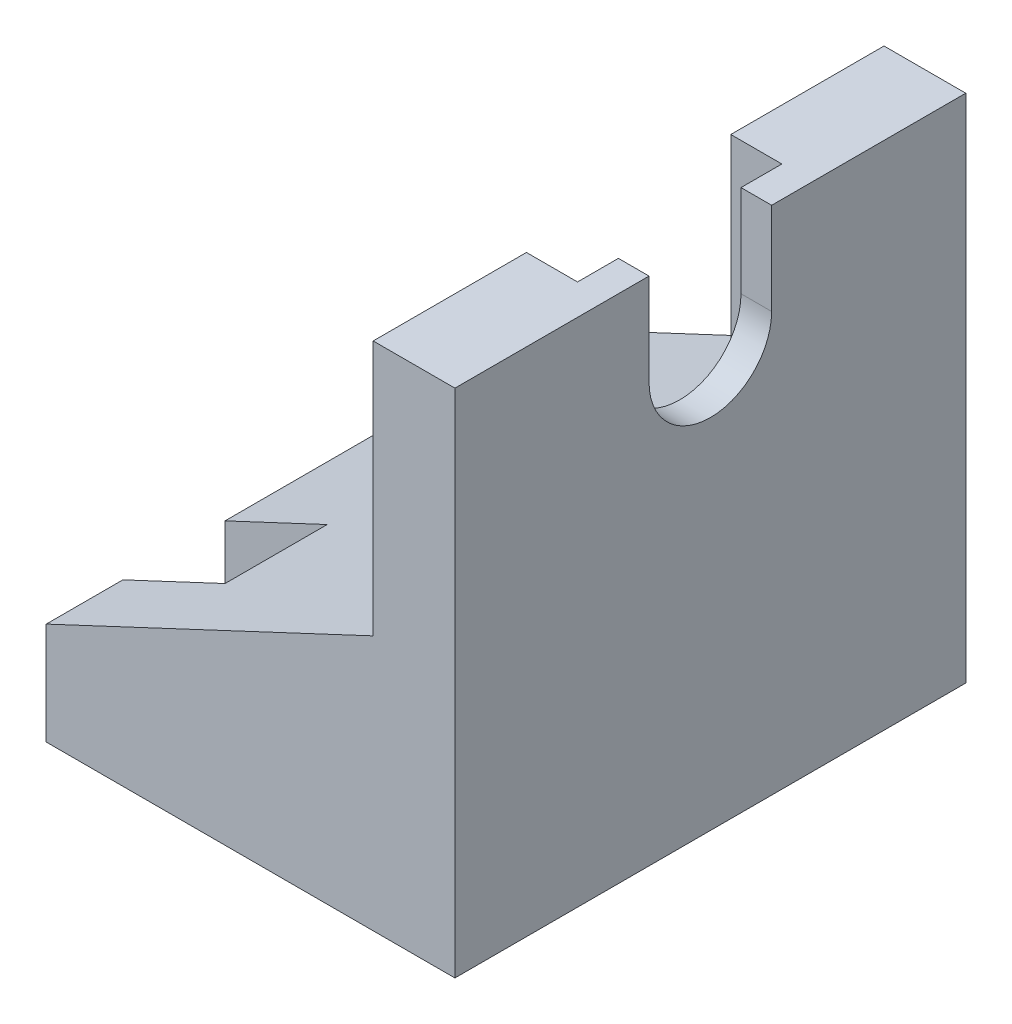
ISO-10303-21;
HEADER;
FILE_DESCRIPTION(('STEP AP214'),'2;1');
FILE_NAME('part.step','',(''),(''),'','','');
FILE_SCHEMA(('AUTOMOTIVE_DESIGN { 1 0 10303 214 1 1 1 1 }'));
ENDSEC;
DATA;
#1=APPLICATION_CONTEXT('core data for automotive mechanical design processes');
#2=APPLICATION_PROTOCOL_DEFINITION('international standard','automotive_design',2000,#1);
#3=PRODUCT_CONTEXT('',#1,'mechanical');
#4=PRODUCT('Part','Part','',(#3));
#5=PRODUCT_RELATED_PRODUCT_CATEGORY('part','',(#4));
#6=PRODUCT_DEFINITION_FORMATION('','',#4);
#7=PRODUCT_DEFINITION_CONTEXT('part definition',#1,'design');
#8=PRODUCT_DEFINITION('design','',#6,#7);
#9=PRODUCT_DEFINITION_SHAPE('','',#8);
#10=(LENGTH_UNIT() NAMED_UNIT(*) SI_UNIT(.MILLI.,.METRE.));
#11=(NAMED_UNIT(*) PLANE_ANGLE_UNIT() SI_UNIT($,.RADIAN.));
#12=(NAMED_UNIT(*) SI_UNIT($,.STERADIAN.) SOLID_ANGLE_UNIT());
#13=UNCERTAINTY_MEASURE_WITH_UNIT(LENGTH_MEASURE(1.E-05),#10,'distance_accuracy_value','');
#14=(GEOMETRIC_REPRESENTATION_CONTEXT(3) GLOBAL_UNCERTAINTY_ASSIGNED_CONTEXT((#13)) GLOBAL_UNIT_ASSIGNED_CONTEXT((#10,
#11,#12)) REPRESENTATION_CONTEXT('',''));
#15=CARTESIAN_POINT('',(0.,0.,0.));
#16=DIRECTION('',(0.,0.,1.));
#17=DIRECTION('',(1.,0.,0.));
#18=AXIS2_PLACEMENT_3D('',#15,#16,#17);
#19=CARTESIAN_POINT('',(0.,25.,50.));
#20=DIRECTION('',(0.,1.,0.));
#21=DIRECTION('',(0.,0.,1.));
#22=AXIS2_PLACEMENT_3D('',#19,#20,#21);
#23=PLANE('',#22);
#24=DIRECTION('',(-1.,0.,0.));
#25=VECTOR('',#24,1.);
#26=CARTESIAN_POINT('',(0.,25.,31.));
#27=LINE('',#26,#25);
#28=CARTESIAN_POINT('',(20.,25.,31.));
#29=VERTEX_POINT('',#28);
#30=CARTESIAN_POINT('',(17.,25.,31.));
#31=VERTEX_POINT('',#30);
#32=EDGE_CURVE('E44',#29,#31,#27,.T.);
#33=ORIENTED_EDGE('',*,*,#32,.T.);
#34=DIRECTION('',(0.,0.,-1.));
#35=VECTOR('',#34,1.);
#36=CARTESIAN_POINT('',(17.,25.,35.));
#37=LINE('',#36,#35);
#38=CARTESIAN_POINT('',(17.,25.,35.));
#39=VERTEX_POINT('',#38);
#40=EDGE_CURVE('E242',#39,#31,#37,.T.);
#41=ORIENTED_EDGE('',*,*,#40,.F.);
#42=DIRECTION('',(-1.,0.,0.));
#43=VECTOR('',#42,1.);
#44=CARTESIAN_POINT('',(17.,25.,35.));
#45=LINE('',#44,#43);
#46=CARTESIAN_POINT('',(12.,25.,35.));
#47=VERTEX_POINT('',#46);
#48=EDGE_CURVE('E361',#39,#47,#45,.T.);
#49=ORIENTED_EDGE('',*,*,#48,.T.);
#50=DIRECTION('',(0.,0.,-1.));
#51=VECTOR('',#50,1.);
#52=CARTESIAN_POINT('',(12.,25.,50.));
#53=LINE('',#52,#51);
#54=CARTESIAN_POINT('',(12.,25.,50.));
#55=VERTEX_POINT('',#54);
#56=EDGE_CURVE('E209',#55,#47,#53,.T.);
#57=ORIENTED_EDGE('',*,*,#56,.F.);
#58=DIRECTION('',(1.,0.,0.));
#59=VECTOR('',#58,1.);
#60=CARTESIAN_POINT('',(0.,25.,50.));
#61=LINE('',#60,#59);
#62=CARTESIAN_POINT('',(20.,25.,50.));
#63=VERTEX_POINT('',#62);
#64=EDGE_CURVE('E210',#55,#63,#61,.T.);
#65=ORIENTED_EDGE('',*,*,#64,.T.);
#66=DIRECTION('',(0.,0.,-1.));
#67=VECTOR('',#66,1.);
#68=CARTESIAN_POINT('',(20.,25.,50.));
#69=LINE('',#68,#67);
#70=EDGE_CURVE('E219',#63,#29,#69,.T.);
#71=ORIENTED_EDGE('',*,*,#70,.T.);
#72=EDGE_LOOP('',(#33,#41,#49,#57,#65,#71));
#73=FACE_BOUND('',#72,.T.);
#74=ADVANCED_FACE('F36',(#73),#23,.T.);
#75=DIRECTION('',(-1.,0.,0.));
#76=VECTOR('',#75,1.);
#77=CARTESIAN_POINT('',(17.,25.,15.));
#78=LINE('',#77,#76);
#79=CARTESIAN_POINT('',(17.,25.,15.));
#80=VERTEX_POINT('',#79);
#81=CARTESIAN_POINT('',(12.,25.,15.));
#82=VERTEX_POINT('',#81);
#83=EDGE_CURVE('E186',#80,#82,#78,.T.);
#84=ORIENTED_EDGE('',*,*,#83,.F.);
#85=CARTESIAN_POINT('',(17.,25.,19.));
#86=VERTEX_POINT('',#85);
#87=EDGE_CURVE('E373',#86,#80,#37,.T.);
#88=ORIENTED_EDGE('',*,*,#87,.F.);
#89=DIRECTION('',(1.,0.,0.));
#90=VECTOR('',#89,1.);
#91=CARTESIAN_POINT('',(0.,25.,19.));
#92=LINE('',#91,#90);
#93=CARTESIAN_POINT('',(20.,25.,19.));
#94=VERTEX_POINT('',#93);
#95=EDGE_CURVE('E58',#86,#94,#92,.T.);
#96=ORIENTED_EDGE('',*,*,#95,.T.);
#97=CARTESIAN_POINT('',(20.,25.,0.));
#98=VERTEX_POINT('',#97);
#99=EDGE_CURVE('E212',#94,#98,#69,.T.);
#100=ORIENTED_EDGE('',*,*,#99,.T.);
#101=DIRECTION('',(1.,0.,0.));
#102=VECTOR('',#101,1.);
#103=CARTESIAN_POINT('',(0.,25.,0.));
#104=LINE('',#103,#102);
#105=CARTESIAN_POINT('',(12.,25.,0.));
#106=VERTEX_POINT('',#105);
#107=EDGE_CURVE('E208',#106,#98,#104,.T.);
#108=ORIENTED_EDGE('',*,*,#107,.F.);
#109=EDGE_CURVE('E199',#82,#106,#53,.T.);
#110=ORIENTED_EDGE('',*,*,#109,.F.);
#111=EDGE_LOOP('',(#84,#88,#96,#100,#108,#110));
#112=FACE_BOUND('',#111,.T.);
#113=ADVANCED_FACE('F206',(#112),#23,.T.);
#114=CARTESIAN_POINT('',(-30.,16.,25.));
#115=DIRECTION('',(1.,0.,0.));
#116=DIRECTION('',(0.,0.,-1.));
#117=AXIS2_PLACEMENT_3D('',#114,#115,#116);
#118=CYLINDRICAL_SURFACE('',#117,6.);
#119=CARTESIAN_POINT('',(17.,16.,25.));
#120=DIRECTION('',(-1.,0.,0.));
#121=DIRECTION('',(0.,0.,1.));
#122=AXIS2_PLACEMENT_3D('',#119,#120,#121);
#123=CIRCLE('',#122,6.);
#124=CARTESIAN_POINT('',(17.,16.,31.));
#125=VERTEX_POINT('',#124);
#126=CARTESIAN_POINT('',(17.,16.,19.));
#127=VERTEX_POINT('',#126);
#128=EDGE_CURVE('E51',#125,#127,#123,.F.);
#129=ORIENTED_EDGE('',*,*,#128,.F.);
#130=DIRECTION('',(1.,0.,0.));
#131=VECTOR('',#130,1.);
#132=CARTESIAN_POINT('',(-30.,16.,31.));
#133=LINE('',#132,#131);
#134=CARTESIAN_POINT('',(20.,16.,31.));
#135=VERTEX_POINT('',#134);
#136=EDGE_CURVE('E266',#125,#135,#133,.T.);
#137=ORIENTED_EDGE('',*,*,#136,.T.);
#138=CARTESIAN_POINT('',(20.,16.,25.));
#139=DIRECTION('',(1.,0.,0.));
#140=DIRECTION('',(0.,0.,-1.));
#141=AXIS2_PLACEMENT_3D('',#138,#139,#140);
#142=CIRCLE('',#141,6.);
#143=CARTESIAN_POINT('',(20.,16.,19.));
#144=VERTEX_POINT('',#143);
#145=EDGE_CURVE('E258',#135,#144,#142,.T.);
#146=ORIENTED_EDGE('',*,*,#145,.T.);
#147=DIRECTION('',(1.,0.,0.));
#148=VECTOR('',#147,1.);
#149=CARTESIAN_POINT('',(-30.,16.,19.));
#150=LINE('',#149,#148);
#151=EDGE_CURVE('E267',#127,#144,#150,.T.);
#152=ORIENTED_EDGE('',*,*,#151,.F.);
#153=EDGE_LOOP('',(#129,#137,#146,#152));
#154=FACE_BOUND('',#153,.T.);
#155=ADVANCED_FACE('F387',(#154),#118,.F.);
#156=CARTESIAN_POINT('',(-30.,0.,31.));
#157=DIRECTION('',(0.,0.,-1.));
#158=DIRECTION('',(-1.,0.,0.));
#159=AXIS2_PLACEMENT_3D('',#156,#157,#158);
#160=PLANE('',#159);
#161=ORIENTED_EDGE('',*,*,#136,.F.);
#162=DIRECTION('',(0.,1.,0.));
#163=VECTOR('',#162,1.);
#164=CARTESIAN_POINT('',(17.,0.,31.));
#165=LINE('',#164,#163);
#166=EDGE_CURVE('E252',#125,#31,#165,.T.);
#167=ORIENTED_EDGE('',*,*,#166,.T.);
#168=ORIENTED_EDGE('',*,*,#32,.F.);
#169=DIRECTION('',(0.,1.,0.));
#170=VECTOR('',#169,1.);
#171=CARTESIAN_POINT('',(20.,0.,31.));
#172=LINE('',#171,#170);
#173=EDGE_CURVE('E250',#135,#29,#172,.T.);
#174=ORIENTED_EDGE('',*,*,#173,.F.);
#175=EDGE_LOOP('',(#161,#167,#168,#174));
#176=FACE_BOUND('',#175,.T.);
#177=ADVANCED_FACE('F249',(#176),#160,.T.);
#178=CARTESIAN_POINT('',(-30.,0.,19.));
#179=DIRECTION('',(0.,0.,1.));
#180=DIRECTION('',(1.,0.,0.));
#181=AXIS2_PLACEMENT_3D('',#178,#179,#180);
#182=PLANE('',#181);
#183=ORIENTED_EDGE('',*,*,#95,.F.);
#184=DIRECTION('',(0.,-1.,0.));
#185=VECTOR('',#184,1.);
#186=CARTESIAN_POINT('',(17.,0.,19.));
#187=LINE('',#186,#185);
#188=EDGE_CURVE('E11',#86,#127,#187,.T.);
#189=ORIENTED_EDGE('',*,*,#188,.T.);
#190=ORIENTED_EDGE('',*,*,#151,.T.);
#191=DIRECTION('',(0.,-1.,0.));
#192=VECTOR('',#191,1.);
#193=CARTESIAN_POINT('',(20.,0.,19.));
#194=LINE('',#193,#192);
#195=EDGE_CURVE('E260',#94,#144,#194,.T.);
#196=ORIENTED_EDGE('',*,*,#195,.F.);
#197=EDGE_LOOP('',(#183,#189,#190,#196));
#198=FACE_BOUND('',#197,.T.);
#199=ADVANCED_FACE('F384',(#198),#182,.T.);
#200=CARTESIAN_POINT('',(12.,0.,50.));
#201=DIRECTION('',(1.,0.,0.));
#202=DIRECTION('',(0.,0.,-1.));
#203=AXIS2_PLACEMENT_3D('',#200,#201,#202);
#204=PLANE('',#203);
#205=ORIENTED_EDGE('',*,*,#56,.T.);
#206=DIRECTION('',(0.,-1.,0.));
#207=VECTOR('',#206,1.);
#208=CARTESIAN_POINT('',(12.,25.,35.));
#209=LINE('',#208,#207);
#210=CARTESIAN_POINT('',(12.,5.,35.));
#211=VERTEX_POINT('',#210);
#212=EDGE_CURVE('E362',#47,#211,#209,.T.);
#213=ORIENTED_EDGE('',*,*,#212,.T.);
#214=DIRECTION('',(0.,0.,-1.));
#215=VECTOR('',#214,1.);
#216=CARTESIAN_POINT('',(12.,5.,35.));
#217=LINE('',#216,#215);
#218=CARTESIAN_POINT('',(12.,5.,15.));
#219=VERTEX_POINT('',#218);
#220=EDGE_CURVE('E202',#211,#219,#217,.T.);
#221=ORIENTED_EDGE('',*,*,#220,.T.);
#222=DIRECTION('',(0.,-1.,0.));
#223=VECTOR('',#222,1.);
#224=CARTESIAN_POINT('',(12.,25.,15.));
#225=LINE('',#224,#223);
#226=EDGE_CURVE('E190',#82,#219,#225,.T.);
#227=ORIENTED_EDGE('',*,*,#226,.F.);
#228=ORIENTED_EDGE('',*,*,#109,.T.);
#229=DIRECTION('',(0.,-1.,0.));
#230=VECTOR('',#229,1.);
#231=CARTESIAN_POINT('',(12.,0.,0.));
#232=LINE('',#231,#230);
#233=CARTESIAN_POINT('',(12.,0.,0.));
#234=VERTEX_POINT('',#233);
#235=EDGE_CURVE('E323',#106,#234,#232,.T.);
#236=ORIENTED_EDGE('',*,*,#235,.T.);
#237=DIRECTION('',(0.,0.,-1.));
#238=VECTOR('',#237,1.);
#239=CARTESIAN_POINT('',(12.,0.,50.));
#240=LINE('',#239,#238);
#241=CARTESIAN_POINT('',(12.,0.,50.));
#242=VERTEX_POINT('',#241);
#243=EDGE_CURVE('E234',#242,#234,#240,.T.);
#244=ORIENTED_EDGE('',*,*,#243,.F.);
#245=DIRECTION('',(0.,-1.,0.));
#246=VECTOR('',#245,1.);
#247=CARTESIAN_POINT('',(12.,0.,50.));
#248=LINE('',#247,#246);
#249=EDGE_CURVE('E324',#55,#242,#248,.T.);
#250=ORIENTED_EDGE('',*,*,#249,.F.);
#251=EDGE_LOOP('',(#205,#213,#221,#227,#228,#236,#244,#250));
#252=FACE_BOUND('',#251,.T.);
#253=ADVANCED_FACE('F38',(#252),#204,.F.);
#254=CARTESIAN_POINT('',(20.,0.,50.));
#255=DIRECTION('',(-1.,0.,0.));
#256=DIRECTION('',(0.,0.,1.));
#257=AXIS2_PLACEMENT_3D('',#254,#255,#256);
#258=PLANE('',#257);
#259=ORIENTED_EDGE('',*,*,#173,.T.);
#260=ORIENTED_EDGE('',*,*,#70,.F.);
#261=DIRECTION('',(0.,1.,0.));
#262=VECTOR('',#261,1.);
#263=CARTESIAN_POINT('',(20.,0.,50.));
#264=LINE('',#263,#262);
#265=CARTESIAN_POINT('',(20.,-25.,50.));
#266=VERTEX_POINT('',#265);
#267=EDGE_CURVE('E214',#266,#63,#264,.T.);
#268=ORIENTED_EDGE('',*,*,#267,.F.);
#269=DIRECTION('',(0.,0.,-1.));
#270=VECTOR('',#269,1.);
#271=CARTESIAN_POINT('',(20.,-25.,50.));
#272=LINE('',#271,#270);
#273=CARTESIAN_POINT('',(20.,-25.,0.));
#274=VERTEX_POINT('',#273);
#275=EDGE_CURVE('E222',#266,#274,#272,.T.);
#276=ORIENTED_EDGE('',*,*,#275,.T.);
#277=DIRECTION('',(0.,1.,0.));
#278=VECTOR('',#277,1.);
#279=CARTESIAN_POINT('',(20.,0.,0.));
#280=LINE('',#279,#278);
#281=EDGE_CURVE('E343',#274,#98,#280,.T.);
#282=ORIENTED_EDGE('',*,*,#281,.T.);
#283=ORIENTED_EDGE('',*,*,#99,.F.);
#284=ORIENTED_EDGE('',*,*,#195,.T.);
#285=ORIENTED_EDGE('',*,*,#145,.F.);
#286=EDGE_LOOP('',(#259,#260,#268,#276,#282,#283,#284,#285));
#287=FACE_BOUND('',#286,.T.);
#288=ADVANCED_FACE('F254',(#287),#258,.F.);
#289=CARTESIAN_POINT('',(-20.,0.,50.));
#290=DIRECTION('',(-1.,0.,0.));
#291=DIRECTION('',(0.,0.,1.));
#292=AXIS2_PLACEMENT_3D('',#289,#290,#291);
#293=PLANE('',#292);
#294=DIRECTION('',(0.,-1.,0.));
#295=VECTOR('',#294,1.);
#296=CARTESIAN_POINT('',(-20.,25.,42.5));
#297=LINE('',#296,#295);
#298=CARTESIAN_POINT('',(-20.,-15.,42.5));
#299=VERTEX_POINT('',#298);
#300=CARTESIAN_POINT('',(-20.,-25.,42.5));
#301=VERTEX_POINT('',#300);
#302=EDGE_CURVE('E279',#299,#301,#297,.T.);
#303=ORIENTED_EDGE('',*,*,#302,.T.);
#304=DIRECTION('',(0.,0.,-1.));
#305=VECTOR('',#304,1.);
#306=CARTESIAN_POINT('',(-20.,-25.,50.));
#307=LINE('',#306,#305);
#308=CARTESIAN_POINT('',(-20.,-25.,50.));
#309=VERTEX_POINT('',#308);
#310=EDGE_CURVE('E226',#309,#301,#307,.T.);
#311=ORIENTED_EDGE('',*,*,#310,.F.);
#312=DIRECTION('',(0.,1.,0.));
#313=VECTOR('',#312,1.);
#314=CARTESIAN_POINT('',(-20.,0.,50.));
#315=LINE('',#314,#313);
#316=CARTESIAN_POINT('',(-20.,-15.,50.));
#317=VERTEX_POINT('',#316);
#318=EDGE_CURVE('E329',#309,#317,#315,.T.);
#319=ORIENTED_EDGE('',*,*,#318,.T.);
#320=DIRECTION('',(0.,0.,-1.));
#321=VECTOR('',#320,1.);
#322=CARTESIAN_POINT('',(-20.,-15.,50.));
#323=LINE('',#322,#321);
#324=EDGE_CURVE('E231',#317,#299,#323,.T.);
#325=ORIENTED_EDGE('',*,*,#324,.T.);
#326=EDGE_LOOP('',(#303,#311,#319,#325));
#327=FACE_BOUND('',#326,.T.);
#328=ADVANCED_FACE('F405',(#327),#293,.T.);
#329=DIRECTION('',(0.,-1.,0.));
#330=VECTOR('',#329,1.);
#331=CARTESIAN_POINT('',(-20.,25.,32.5));
#332=LINE('',#331,#330);
#333=CARTESIAN_POINT('',(-20.,-15.,32.5));
#334=VERTEX_POINT('',#333);
#335=CARTESIAN_POINT('',(-20.,-25.,32.5));
#336=VERTEX_POINT('',#335);
#337=EDGE_CURVE('E278',#334,#336,#332,.T.);
#338=ORIENTED_EDGE('',*,*,#337,.F.);
#339=CARTESIAN_POINT('',(-20.,-15.,17.5));
#340=VERTEX_POINT('',#339);
#341=EDGE_CURVE('E235',#334,#340,#323,.T.);
#342=ORIENTED_EDGE('',*,*,#341,.T.);
#343=DIRECTION('',(0.,-1.,0.));
#344=VECTOR('',#343,1.);
#345=CARTESIAN_POINT('',(-20.,25.,17.5));
#346=LINE('',#345,#344);
#347=CARTESIAN_POINT('',(-20.,-25.,17.5));
#348=VERTEX_POINT('',#347);
#349=EDGE_CURVE('E306',#340,#348,#346,.T.);
#350=ORIENTED_EDGE('',*,*,#349,.T.);
#351=EDGE_CURVE('E230',#336,#348,#307,.T.);
#352=ORIENTED_EDGE('',*,*,#351,.F.);
#353=EDGE_LOOP('',(#338,#342,#350,#352));
#354=FACE_BOUND('',#353,.T.);
#355=ADVANCED_FACE('F413',(#354),#293,.T.);
#356=CARTESIAN_POINT('',(2.16172938350681,-4.61168935148119,50.));
#357=DIRECTION('',(0.424433876230719,-0.905458935958868,0.));
#358=DIRECTION('',(0.905458935958869,0.42443387623072,0.));
#359=AXIS2_PLACEMENT_3D('',#356,#357,#358);
#360=PLANE('',#359);
#361=DIRECTION('',(0.,0.,1.));
#362=VECTOR('',#361,1.);
#363=CARTESIAN_POINT('',(-10.,-10.3125,50.));
#364=LINE('',#363,#362);
#365=CARTESIAN_POINT('',(-10.,-10.3125,32.5));
#366=VERTEX_POINT('',#365);
#367=CARTESIAN_POINT('',(-10.,-10.3125,42.5));
#368=VERTEX_POINT('',#367);
#369=EDGE_CURVE('E290',#366,#368,#364,.T.);
#370=ORIENTED_EDGE('',*,*,#369,.T.);
#371=DIRECTION('',(-0.905458935958869,-0.42443387623072,0.));
#372=VECTOR('',#371,1.);
#373=CARTESIAN_POINT('',(2.16172938350681,-4.61168935148119,42.5));
#374=LINE('',#373,#372);
#375=EDGE_CURVE('E293',#368,#299,#374,.T.);
#376=ORIENTED_EDGE('',*,*,#375,.T.);
#377=ORIENTED_EDGE('',*,*,#324,.F.);
#378=DIRECTION('',(-0.905458935958869,-0.42443387623072,0.));
#379=VECTOR('',#378,1.);
#380=CARTESIAN_POINT('',(2.16172938350681,-4.61168935148119,50.));
#381=LINE('',#380,#379);
#382=EDGE_CURVE('E327',#242,#317,#381,.T.);
#383=ORIENTED_EDGE('',*,*,#382,.F.);
#384=ORIENTED_EDGE('',*,*,#243,.T.);
#385=DIRECTION('',(-0.905458935958869,-0.42443387623072,0.));
#386=VECTOR('',#385,1.);
#387=CARTESIAN_POINT('',(2.16172938350681,-4.61168935148119,0.));
#388=LINE('',#387,#386);
#389=CARTESIAN_POINT('',(-20.,-15.,0.));
#390=VERTEX_POINT('',#389);
#391=EDGE_CURVE('E336',#234,#390,#388,.T.);
#392=ORIENTED_EDGE('',*,*,#391,.T.);
#393=CARTESIAN_POINT('',(-20.,-15.,7.5));
#394=VERTEX_POINT('',#393);
#395=EDGE_CURVE('E229',#394,#390,#323,.T.);
#396=ORIENTED_EDGE('',*,*,#395,.F.);
#397=DIRECTION('',(0.905458935958869,0.42443387623072,0.));
#398=VECTOR('',#397,1.);
#399=CARTESIAN_POINT('',(2.16172938350681,-4.61168935148118,7.5));
#400=LINE('',#399,#398);
#401=CARTESIAN_POINT('',(-10.,-10.3125,7.5));
#402=VERTEX_POINT('',#401);
#403=EDGE_CURVE('E309',#394,#402,#400,.T.);
#404=ORIENTED_EDGE('',*,*,#403,.T.);
#405=DIRECTION('',(0.,0.,1.));
#406=VECTOR('',#405,1.);
#407=CARTESIAN_POINT('',(-10.,-10.3125,50.));
#408=LINE('',#407,#406);
#409=CARTESIAN_POINT('',(-10.,-10.3125,17.5));
#410=VERTEX_POINT('',#409);
#411=EDGE_CURVE('E317',#402,#410,#408,.T.);
#412=ORIENTED_EDGE('',*,*,#411,.T.);
#413=DIRECTION('',(-0.905458935958869,-0.42443387623072,0.));
#414=VECTOR('',#413,1.);
#415=CARTESIAN_POINT('',(2.16172938350681,-4.61168935148119,17.5));
#416=LINE('',#415,#414);
#417=EDGE_CURVE('E320',#410,#340,#416,.T.);
#418=ORIENTED_EDGE('',*,*,#417,.T.);
#419=ORIENTED_EDGE('',*,*,#341,.F.);
#420=DIRECTION('',(0.905458935958869,0.42443387623072,0.));
#421=VECTOR('',#420,1.);
#422=CARTESIAN_POINT('',(2.16172938350681,-4.61168935148119,32.5));
#423=LINE('',#422,#421);
#424=EDGE_CURVE('E282',#334,#366,#423,.T.);
#425=ORIENTED_EDGE('',*,*,#424,.T.);
#426=EDGE_LOOP('',(#370,#376,#377,#383,#384,#392,#396,#404,#412,#418,#419,#425));
#427=FACE_BOUND('',#426,.T.);
#428=ADVANCED_FACE('F354',(#427),#360,.F.);
#429=DIRECTION('',(0.,-1.,0.));
#430=VECTOR('',#429,1.);
#431=CARTESIAN_POINT('',(-20.,25.,7.5));
#432=LINE('',#431,#430);
#433=CARTESIAN_POINT('',(-20.,-25.,7.49999999999999));
#434=VERTEX_POINT('',#433);
#435=EDGE_CURVE('E305',#394,#434,#432,.T.);
#436=ORIENTED_EDGE('',*,*,#435,.F.);
#437=ORIENTED_EDGE('',*,*,#395,.T.);
#438=DIRECTION('',(0.,1.,0.));
#439=VECTOR('',#438,1.);
#440=CARTESIAN_POINT('',(-20.,0.,0.));
#441=LINE('',#440,#439);
#442=CARTESIAN_POINT('',(-20.,-25.,0.));
#443=VERTEX_POINT('',#442);
#444=EDGE_CURVE('E339',#443,#390,#441,.T.);
#445=ORIENTED_EDGE('',*,*,#444,.F.);
#446=EDGE_CURVE('E225',#434,#443,#307,.T.);
#447=ORIENTED_EDGE('',*,*,#446,.F.);
#448=EDGE_LOOP('',(#436,#437,#445,#447));
#449=FACE_BOUND('',#448,.T.);
#450=ADVANCED_FACE('F409',(#449),#293,.T.);
#451=CARTESIAN_POINT('',(0.,-25.,50.));
#452=DIRECTION('',(0.,1.,0.));
#453=DIRECTION('',(0.,0.,1.));
#454=AXIS2_PLACEMENT_3D('',#451,#452,#453);
#455=PLANE('',#454);
#456=ORIENTED_EDGE('',*,*,#310,.T.);
#457=DIRECTION('',(-1.,0.,0.));
#458=VECTOR('',#457,1.);
#459=CARTESIAN_POINT('',(-10.,-25.,42.5));
#460=LINE('',#459,#458);
#461=CARTESIAN_POINT('',(-10.,-25.,42.5));
#462=VERTEX_POINT('',#461);
#463=EDGE_CURVE('E276',#462,#301,#460,.T.);
#464=ORIENTED_EDGE('',*,*,#463,.F.);
#465=DIRECTION('',(0.,0.,1.));
#466=VECTOR('',#465,1.);
#467=CARTESIAN_POINT('',(-10.,-25.,32.5));
#468=LINE('',#467,#466);
#469=CARTESIAN_POINT('',(-10.,-25.,32.5));
#470=VERTEX_POINT('',#469);
#471=EDGE_CURVE('E273',#470,#462,#468,.T.);
#472=ORIENTED_EDGE('',*,*,#471,.F.);
#473=DIRECTION('',(1.,0.,0.));
#474=VECTOR('',#473,1.);
#475=CARTESIAN_POINT('',(-10.,-25.,32.5));
#476=LINE('',#475,#474);
#477=EDGE_CURVE('E269',#336,#470,#476,.T.);
#478=ORIENTED_EDGE('',*,*,#477,.F.);
#479=ORIENTED_EDGE('',*,*,#351,.T.);
#480=DIRECTION('',(-1.,0.,0.));
#481=VECTOR('',#480,1.);
#482=CARTESIAN_POINT('',(-10.,-25.,17.5));
#483=LINE('',#482,#481);
#484=CARTESIAN_POINT('',(-10.,-25.,17.5));
#485=VERTEX_POINT('',#484);
#486=EDGE_CURVE('E302',#485,#348,#483,.T.);
#487=ORIENTED_EDGE('',*,*,#486,.F.);
#488=DIRECTION('',(0.,0.,1.));
#489=VECTOR('',#488,1.);
#490=CARTESIAN_POINT('',(-10.,-25.,7.5));
#491=LINE('',#490,#489);
#492=CARTESIAN_POINT('',(-10.,-25.,7.5));
#493=VERTEX_POINT('',#492);
#494=EDGE_CURVE('E299',#493,#485,#491,.T.);
#495=ORIENTED_EDGE('',*,*,#494,.F.);
#496=DIRECTION('',(1.,0.,0.));
#497=VECTOR('',#496,1.);
#498=CARTESIAN_POINT('',(-10.,-25.,7.5));
#499=LINE('',#498,#497);
#500=EDGE_CURVE('E296',#434,#493,#499,.T.);
#501=ORIENTED_EDGE('',*,*,#500,.F.);
#502=ORIENTED_EDGE('',*,*,#446,.T.);
#503=DIRECTION('',(1.,0.,0.));
#504=VECTOR('',#503,1.);
#505=CARTESIAN_POINT('',(0.,-25.,0.));
#506=LINE('',#505,#504);
#507=EDGE_CURVE('E342',#443,#274,#506,.T.);
#508=ORIENTED_EDGE('',*,*,#507,.T.);
#509=ORIENTED_EDGE('',*,*,#275,.F.);
#510=DIRECTION('',(1.,0.,0.));
#511=VECTOR('',#510,1.);
#512=CARTESIAN_POINT('',(0.,-25.,50.));
#513=LINE('',#512,#511);
#514=EDGE_CURVE('E332',#309,#266,#513,.T.);
#515=ORIENTED_EDGE('',*,*,#514,.F.);
#516=EDGE_LOOP('',(#456,#464,#472,#478,#479,#487,#495,#501,#502,#508,#509,#515));
#517=FACE_BOUND('',#516,.T.);
#518=ADVANCED_FACE('F406',(#517),#455,.F.);
#519=CARTESIAN_POINT('',(0.,0.,50.));
#520=DIRECTION('',(0.,0.,1.));
#521=DIRECTION('',(1.,0.,0.));
#522=AXIS2_PLACEMENT_3D('',#519,#520,#521);
#523=PLANE('',#522);
#524=ORIENTED_EDGE('',*,*,#249,.T.);
#525=ORIENTED_EDGE('',*,*,#382,.T.);
#526=ORIENTED_EDGE('',*,*,#318,.F.);
#527=ORIENTED_EDGE('',*,*,#514,.T.);
#528=ORIENTED_EDGE('',*,*,#267,.T.);
#529=ORIENTED_EDGE('',*,*,#64,.F.);
#530=EDGE_LOOP('',(#524,#525,#526,#527,#528,#529));
#531=FACE_BOUND('',#530,.T.);
#532=ADVANCED_FACE('F359',(#531),#523,.T.);
#533=CARTESIAN_POINT('',(0.,0.,0.));
#534=DIRECTION('',(0.,0.,1.));
#535=DIRECTION('',(1.,0.,0.));
#536=AXIS2_PLACEMENT_3D('',#533,#534,#535);
#537=PLANE('',#536);
#538=ORIENTED_EDGE('',*,*,#235,.F.);
#539=ORIENTED_EDGE('',*,*,#107,.T.);
#540=ORIENTED_EDGE('',*,*,#281,.F.);
#541=ORIENTED_EDGE('',*,*,#507,.F.);
#542=ORIENTED_EDGE('',*,*,#444,.T.);
#543=ORIENTED_EDGE('',*,*,#391,.F.);
#544=EDGE_LOOP('',(#538,#539,#540,#541,#542,#543));
#545=FACE_BOUND('',#544,.T.);
#546=ADVANCED_FACE('F348',(#545),#537,.F.);
#547=CARTESIAN_POINT('',(-10.,25.,17.5));
#548=DIRECTION('',(0.,0.,1.));
#549=DIRECTION('',(1.,0.,0.));
#550=AXIS2_PLACEMENT_3D('',#547,#548,#549);
#551=PLANE('',#550);
#552=DIRECTION('',(0.,-1.,0.));
#553=VECTOR('',#552,1.);
#554=CARTESIAN_POINT('',(-10.,25.,17.5));
#555=LINE('',#554,#553);
#556=EDGE_CURVE('E310',#410,#485,#555,.T.);
#557=ORIENTED_EDGE('',*,*,#556,.T.);
#558=ORIENTED_EDGE('',*,*,#486,.T.);
#559=ORIENTED_EDGE('',*,*,#349,.F.);
#560=ORIENTED_EDGE('',*,*,#417,.F.);
#561=EDGE_LOOP('',(#557,#558,#559,#560));
#562=FACE_BOUND('',#561,.T.);
#563=ADVANCED_FACE('F442',(#562),#551,.F.);
#564=CARTESIAN_POINT('',(-10.,25.,7.5));
#565=DIRECTION('',(1.,0.,0.));
#566=DIRECTION('',(0.,0.,-1.));
#567=AXIS2_PLACEMENT_3D('',#564,#565,#566);
#568=PLANE('',#567);
#569=DIRECTION('',(0.,-1.,0.));
#570=VECTOR('',#569,1.);
#571=CARTESIAN_POINT('',(-10.,25.,7.5));
#572=LINE('',#571,#570);
#573=EDGE_CURVE('E312',#402,#493,#572,.T.);
#574=ORIENTED_EDGE('',*,*,#573,.T.);
#575=ORIENTED_EDGE('',*,*,#494,.T.);
#576=ORIENTED_EDGE('',*,*,#556,.F.);
#577=ORIENTED_EDGE('',*,*,#411,.F.);
#578=EDGE_LOOP('',(#574,#575,#576,#577));
#579=FACE_BOUND('',#578,.T.);
#580=ADVANCED_FACE('F438',(#579),#568,.F.);
#581=CARTESIAN_POINT('',(-10.,25.,7.5));
#582=DIRECTION('',(0.,0.,-1.));
#583=DIRECTION('',(-1.,0.,0.));
#584=AXIS2_PLACEMENT_3D('',#581,#582,#583);
#585=PLANE('',#584);
#586=ORIENTED_EDGE('',*,*,#435,.T.);
#587=ORIENTED_EDGE('',*,*,#500,.T.);
#588=ORIENTED_EDGE('',*,*,#573,.F.);
#589=ORIENTED_EDGE('',*,*,#403,.F.);
#590=EDGE_LOOP('',(#586,#587,#588,#589));
#591=FACE_BOUND('',#590,.T.);
#592=ADVANCED_FACE('F434',(#591),#585,.F.);
#593=CARTESIAN_POINT('',(-10.,25.,42.5));
#594=DIRECTION('',(0.,0.,1.));
#595=DIRECTION('',(1.,0.,0.));
#596=AXIS2_PLACEMENT_3D('',#593,#594,#595);
#597=PLANE('',#596);
#598=DIRECTION('',(0.,-1.,0.));
#599=VECTOR('',#598,1.);
#600=CARTESIAN_POINT('',(-10.,25.,42.5));
#601=LINE('',#600,#599);
#602=EDGE_CURVE('E283',#368,#462,#601,.T.);
#603=ORIENTED_EDGE('',*,*,#602,.T.);
#604=ORIENTED_EDGE('',*,*,#463,.T.);
#605=ORIENTED_EDGE('',*,*,#302,.F.);
#606=ORIENTED_EDGE('',*,*,#375,.F.);
#607=EDGE_LOOP('',(#603,#604,#605,#606));
#608=FACE_BOUND('',#607,.T.);
#609=ADVANCED_FACE('F448',(#608),#597,.F.);
#610=CARTESIAN_POINT('',(-10.,25.,32.5));
#611=DIRECTION('',(1.,0.,0.));
#612=DIRECTION('',(0.,0.,-1.));
#613=AXIS2_PLACEMENT_3D('',#610,#611,#612);
#614=PLANE('',#613);
#615=DIRECTION('',(0.,-1.,0.));
#616=VECTOR('',#615,1.);
#617=CARTESIAN_POINT('',(-10.,25.,32.5));
#618=LINE('',#617,#616);
#619=EDGE_CURVE('E285',#366,#470,#618,.T.);
#620=ORIENTED_EDGE('',*,*,#619,.T.);
#621=ORIENTED_EDGE('',*,*,#471,.T.);
#622=ORIENTED_EDGE('',*,*,#602,.F.);
#623=ORIENTED_EDGE('',*,*,#369,.F.);
#624=EDGE_LOOP('',(#620,#621,#622,#623));
#625=FACE_BOUND('',#624,.T.);
#626=ADVANCED_FACE('F452',(#625),#614,.F.);
#627=CARTESIAN_POINT('',(-10.,25.,32.5));
#628=DIRECTION('',(0.,0.,-1.));
#629=DIRECTION('',(-1.,0.,0.));
#630=AXIS2_PLACEMENT_3D('',#627,#628,#629);
#631=PLANE('',#630);
#632=ORIENTED_EDGE('',*,*,#337,.T.);
#633=ORIENTED_EDGE('',*,*,#477,.T.);
#634=ORIENTED_EDGE('',*,*,#619,.F.);
#635=ORIENTED_EDGE('',*,*,#424,.F.);
#636=EDGE_LOOP('',(#632,#633,#634,#635));
#637=FACE_BOUND('',#636,.T.);
#638=ADVANCED_FACE('F453',(#637),#631,.F.);
#639=CARTESIAN_POINT('',(12.,5.,35.));
#640=DIRECTION('',(-0.514495755427526,0.857492925712544,0.));
#641=DIRECTION('',(-0.857492925712544,-0.514495755427526,0.));
#642=AXIS2_PLACEMENT_3D('',#639,#640,#641);
#643=PLANE('',#642);
#644=ORIENTED_EDGE('',*,*,#220,.F.);
#645=DIRECTION('',(0.857492925712544,0.514495755427526,0.));
#646=VECTOR('',#645,1.);
#647=CARTESIAN_POINT('',(12.,5.,35.));
#648=LINE('',#647,#646);
#649=CARTESIAN_POINT('',(17.,8.,35.));
#650=VERTEX_POINT('',#649);
#651=EDGE_CURVE('E365',#211,#650,#648,.T.);
#652=ORIENTED_EDGE('',*,*,#651,.T.);
#653=DIRECTION('',(0.,0.,-1.));
#654=VECTOR('',#653,1.);
#655=CARTESIAN_POINT('',(17.,8.,35.));
#656=LINE('',#655,#654);
#657=CARTESIAN_POINT('',(17.,8.,15.));
#658=VERTEX_POINT('',#657);
#659=EDGE_CURVE('E375',#650,#658,#656,.T.);
#660=ORIENTED_EDGE('',*,*,#659,.T.);
#661=DIRECTION('',(0.857492925712544,0.514495755427526,0.));
#662=VECTOR('',#661,1.);
#663=CARTESIAN_POINT('',(12.,5.,15.));
#664=LINE('',#663,#662);
#665=EDGE_CURVE('E203',#219,#658,#664,.T.);
#666=ORIENTED_EDGE('',*,*,#665,.F.);
#667=EDGE_LOOP('',(#644,#652,#660,#666));
#668=FACE_BOUND('',#667,.T.);
#669=ADVANCED_FACE('F379',(#668),#643,.T.);
#670=CARTESIAN_POINT('',(17.,8.,35.));
#671=DIRECTION('',(-1.,0.,0.));
#672=DIRECTION('',(0.,0.,1.));
#673=AXIS2_PLACEMENT_3D('',#670,#671,#672);
#674=PLANE('',#673);
#675=ORIENTED_EDGE('',*,*,#128,.T.);
#676=ORIENTED_EDGE('',*,*,#188,.F.);
#677=ORIENTED_EDGE('',*,*,#87,.T.);
#678=DIRECTION('',(0.,1.,0.));
#679=VECTOR('',#678,1.);
#680=CARTESIAN_POINT('',(17.,8.,15.));
#681=LINE('',#680,#679);
#682=EDGE_CURVE('E193',#658,#80,#681,.T.);
#683=ORIENTED_EDGE('',*,*,#682,.F.);
#684=ORIENTED_EDGE('',*,*,#659,.F.);
#685=DIRECTION('',(0.,1.,0.));
#686=VECTOR('',#685,1.);
#687=CARTESIAN_POINT('',(17.,8.,35.));
#688=LINE('',#687,#686);
#689=EDGE_CURVE('E367',#650,#39,#688,.T.);
#690=ORIENTED_EDGE('',*,*,#689,.T.);
#691=ORIENTED_EDGE('',*,*,#40,.T.);
#692=ORIENTED_EDGE('',*,*,#166,.F.);
#693=EDGE_LOOP('',(#675,#676,#677,#683,#684,#690,#691,#692));
#694=FACE_BOUND('',#693,.T.);
#695=ADVANCED_FACE('F382',(#694),#674,.T.);
#696=CARTESIAN_POINT('',(0.,0.,35.));
#697=DIRECTION('',(0.,0.,1.));
#698=DIRECTION('',(1.,0.,0.));
#699=AXIS2_PLACEMENT_3D('',#696,#697,#698);
#700=PLANE('',#699);
#701=ORIENTED_EDGE('',*,*,#48,.F.);
#702=ORIENTED_EDGE('',*,*,#689,.F.);
#703=ORIENTED_EDGE('',*,*,#651,.F.);
#704=ORIENTED_EDGE('',*,*,#212,.F.);
#705=EDGE_LOOP('',(#701,#702,#703,#704));
#706=FACE_BOUND('',#705,.T.);
#707=ADVANCED_FACE('F557',(#706),#700,.F.);
#708=CARTESIAN_POINT('',(0.,0.,15.));
#709=DIRECTION('',(0.,0.,1.));
#710=DIRECTION('',(1.,0.,0.));
#711=AXIS2_PLACEMENT_3D('',#708,#709,#710);
#712=PLANE('',#711);
#713=ORIENTED_EDGE('',*,*,#83,.T.);
#714=ORIENTED_EDGE('',*,*,#226,.T.);
#715=ORIENTED_EDGE('',*,*,#665,.T.);
#716=ORIENTED_EDGE('',*,*,#682,.T.);
#717=EDGE_LOOP('',(#713,#714,#715,#716));
#718=FACE_BOUND('',#717,.T.);
#719=ADVANCED_FACE('F188',(#718),#712,.T.);
#720=CLOSED_SHELL('',(#74,#113,#155,#177,#199,#253,#288,#328,#355,#428,#450,#518,#532,#546,#563,
#580,#592,#609,#626,#638,#669,#695,#707,#719));
#721=MANIFOLD_SOLID_BREP('B2',#720);
#722=ADVANCED_BREP_SHAPE_REPRESENTATION('',(#18,#721),#14);
#723=SHAPE_DEFINITION_REPRESENTATION(#9,#722);
ENDSEC;
END-ISO-10303-21;
